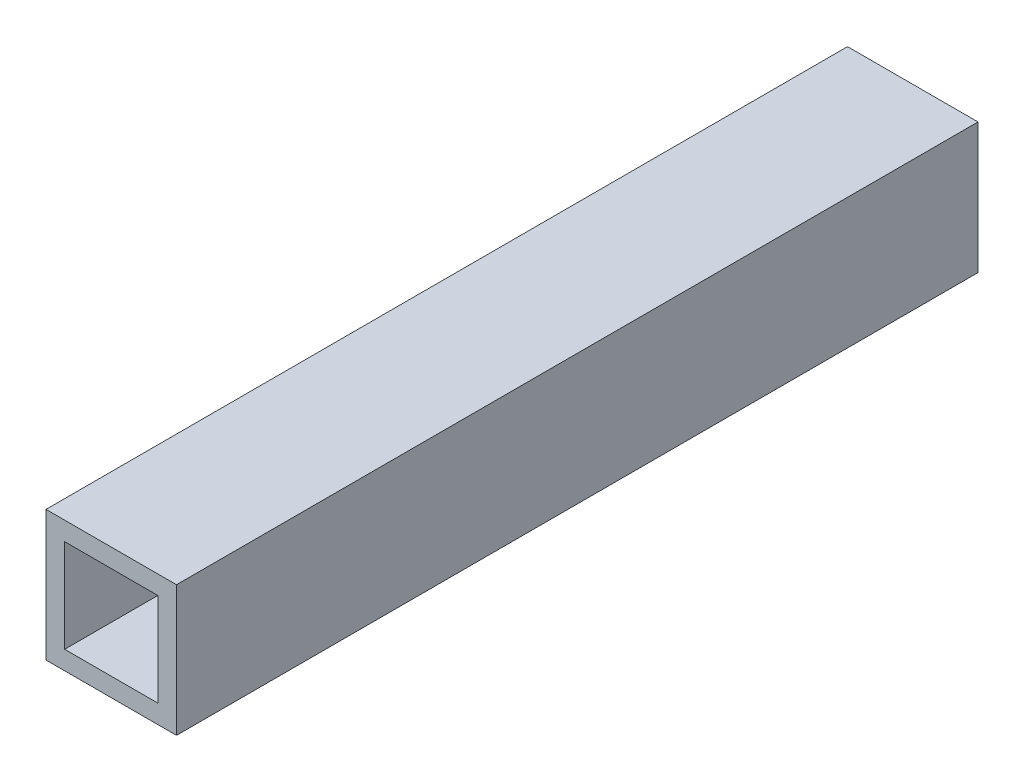
ISO-10303-21;
HEADER;
FILE_DESCRIPTION(('STEP AP214'),'2;1');
FILE_NAME('part.step','',(''),(''),'','','');
FILE_SCHEMA(('AUTOMOTIVE_DESIGN { 1 0 10303 214 1 1 1 1 }'));
ENDSEC;
DATA;
#1=APPLICATION_CONTEXT('core data for automotive mechanical design processes');
#2=APPLICATION_PROTOCOL_DEFINITION('international standard','automotive_design',2000,#1);
#3=PRODUCT_CONTEXT('',#1,'mechanical');
#4=PRODUCT('Part','Part','',(#3));
#5=PRODUCT_RELATED_PRODUCT_CATEGORY('part','',(#4));
#6=PRODUCT_DEFINITION_FORMATION('','',#4);
#7=PRODUCT_DEFINITION_CONTEXT('part definition',#1,'design');
#8=PRODUCT_DEFINITION('design','',#6,#7);
#9=PRODUCT_DEFINITION_SHAPE('','',#8);
#10=(LENGTH_UNIT() NAMED_UNIT(*) SI_UNIT(.MILLI.,.METRE.));
#11=(NAMED_UNIT(*) PLANE_ANGLE_UNIT() SI_UNIT($,.RADIAN.));
#12=(NAMED_UNIT(*) SI_UNIT($,.STERADIAN.) SOLID_ANGLE_UNIT());
#13=UNCERTAINTY_MEASURE_WITH_UNIT(LENGTH_MEASURE(1.E-05),#10,'distance_accuracy_value','');
#14=(GEOMETRIC_REPRESENTATION_CONTEXT(3) GLOBAL_UNCERTAINTY_ASSIGNED_CONTEXT((#13)) GLOBAL_UNIT_ASSIGNED_CONTEXT((#10,
#11,#12)) REPRESENTATION_CONTEXT('',''));
#15=CARTESIAN_POINT('',(0.,0.,0.));
#16=DIRECTION('',(0.,0.,1.));
#17=DIRECTION('',(1.,0.,0.));
#18=AXIS2_PLACEMENT_3D('',#15,#16,#17);
#19=CARTESIAN_POINT('',(-2.,-2.9,0.));
#20=DIRECTION('',(-1.,0.,0.));
#21=DIRECTION('',(0.,0.,1.));
#22=AXIS2_PLACEMENT_3D('',#19,#20,#21);
#23=PLANE('',#22);
#24=DIRECTION('',(0.,0.,-1.));
#25=VECTOR('',#24,1.);
#26=CARTESIAN_POINT('',(-2.,-2.9,0.));
#27=LINE('',#26,#25);
#28=CARTESIAN_POINT('',(-2.,-2.9,4.3));
#29=VERTEX_POINT('',#28);
#30=CARTESIAN_POINT('',(-2.,-2.9,0.));
#31=VERTEX_POINT('',#30);
#32=EDGE_CURVE('E92',#29,#31,#27,.T.);
#33=ORIENTED_EDGE('',*,*,#32,.T.);
#34=DIRECTION('',(0.,1.,0.));
#35=VECTOR('',#34,1.);
#36=CARTESIAN_POINT('',(-2.,-2.9,0.));
#37=LINE('',#36,#35);
#38=CARTESIAN_POINT('',(-2.,-2.4,0.));
#39=VERTEX_POINT('',#38);
#40=EDGE_CURVE('E20',#39,#31,#37,.F.);
#41=ORIENTED_EDGE('',*,*,#40,.F.);
#42=DIRECTION('',(0.,0.,1.));
#43=VECTOR('',#42,1.);
#44=CARTESIAN_POINT('',(-2.,-2.4,0.));
#45=LINE('',#44,#43);
#46=CARTESIAN_POINT('',(-2.,-2.4,4.3));
#47=VERTEX_POINT('',#46);
#48=EDGE_CURVE('E110',#39,#47,#45,.T.);
#49=ORIENTED_EDGE('',*,*,#48,.T.);
#50=DIRECTION('',(0.,1.,0.));
#51=VECTOR('',#50,1.);
#52=CARTESIAN_POINT('',(-2.,-2.9,4.3));
#53=LINE('',#52,#51);
#54=EDGE_CURVE('E79',#29,#47,#53,.T.);
#55=ORIENTED_EDGE('',*,*,#54,.F.);
#56=EDGE_LOOP('',(#33,#41,#49,#55));
#57=FACE_BOUND('',#56,.T.);
#58=ADVANCED_FACE('F17',(#57),#23,.F.);
#59=CARTESIAN_POINT('',(-1.5,-2.9,0.));
#60=DIRECTION('',(0.,-1.,0.));
#61=DIRECTION('',(0.,0.,-1.));
#62=AXIS2_PLACEMENT_3D('',#59,#60,#61);
#63=PLANE('',#62);
#64=DIRECTION('',(0.,0.,-1.));
#65=VECTOR('',#64,1.);
#66=CARTESIAN_POINT('',(-1.5,-2.9,0.));
#67=LINE('',#66,#65);
#68=CARTESIAN_POINT('',(-1.5,-2.9,4.3));
#69=VERTEX_POINT('',#68);
#70=CARTESIAN_POINT('',(-1.5,-2.9,0.));
#71=VERTEX_POINT('',#70);
#72=EDGE_CURVE('E97',#69,#71,#67,.T.);
#73=ORIENTED_EDGE('',*,*,#72,.T.);
#74=DIRECTION('',(1.,0.,0.));
#75=VECTOR('',#74,1.);
#76=CARTESIAN_POINT('',(-1.5,-2.9,0.));
#77=LINE('',#76,#75);
#78=EDGE_CURVE('E87',#31,#71,#77,.T.);
#79=ORIENTED_EDGE('',*,*,#78,.F.);
#80=ORIENTED_EDGE('',*,*,#32,.F.);
#81=DIRECTION('',(1.,0.,0.));
#82=VECTOR('',#81,1.);
#83=CARTESIAN_POINT('',(-1.5,-2.9,4.3));
#84=LINE('',#83,#82);
#85=EDGE_CURVE('E99',#69,#29,#84,.F.);
#86=ORIENTED_EDGE('',*,*,#85,.F.);
#87=EDGE_LOOP('',(#73,#79,#80,#86));
#88=FACE_BOUND('',#87,.T.);
#89=ADVANCED_FACE('F95',(#88),#63,.F.);
#90=CARTESIAN_POINT('',(-2.,-2.4,0.));
#91=DIRECTION('',(0.,1.,0.));
#92=DIRECTION('',(0.,0.,1.));
#93=AXIS2_PLACEMENT_3D('',#90,#91,#92);
#94=PLANE('',#93);
#95=ORIENTED_EDGE('',*,*,#48,.F.);
#96=DIRECTION('',(1.,0.,0.));
#97=VECTOR('',#96,1.);
#98=CARTESIAN_POINT('',(-2.,-2.4,0.));
#99=LINE('',#98,#97);
#100=CARTESIAN_POINT('',(-1.5,-2.4,0.));
#101=VERTEX_POINT('',#100);
#102=EDGE_CURVE('E89',#101,#39,#99,.F.);
#103=ORIENTED_EDGE('',*,*,#102,.F.);
#104=DIRECTION('',(0.,0.,-1.));
#105=VECTOR('',#104,1.);
#106=CARTESIAN_POINT('',(-1.5,-2.4,0.));
#107=LINE('',#106,#105);
#108=CARTESIAN_POINT('',(-1.5,-2.4,4.3));
#109=VERTEX_POINT('',#108);
#110=EDGE_CURVE('E115',#101,#109,#107,.F.);
#111=ORIENTED_EDGE('',*,*,#110,.T.);
#112=DIRECTION('',(1.,0.,0.));
#113=VECTOR('',#112,1.);
#114=CARTESIAN_POINT('',(-1.75,-2.4,4.3));
#115=LINE('',#114,#113);
#116=EDGE_CURVE('E109',#47,#109,#115,.T.);
#117=ORIENTED_EDGE('',*,*,#116,.F.);
#118=EDGE_LOOP('',(#95,#103,#111,#117));
#119=FACE_BOUND('',#118,.T.);
#120=ADVANCED_FACE('F113',(#119),#94,.F.);
#121=CARTESIAN_POINT('',(-1.5,-2.4,0.));
#122=DIRECTION('',(1.,0.,0.));
#123=DIRECTION('',(0.,0.,-1.));
#124=AXIS2_PLACEMENT_3D('',#121,#122,#123);
#125=PLANE('',#124);
#126=ORIENTED_EDGE('',*,*,#110,.F.);
#127=DIRECTION('',(0.,1.,0.));
#128=VECTOR('',#127,1.);
#129=CARTESIAN_POINT('',(-1.5,-2.65,0.));
#130=LINE('',#129,#128);
#131=EDGE_CURVE('E159',#101,#71,#130,.F.);
#132=ORIENTED_EDGE('',*,*,#131,.T.);
#133=ORIENTED_EDGE('',*,*,#72,.F.);
#134=DIRECTION('',(0.,1.,0.));
#135=VECTOR('',#134,1.);
#136=CARTESIAN_POINT('',(-1.5,-2.65,4.3));
#137=LINE('',#136,#135);
#138=EDGE_CURVE('E118',#109,#69,#137,.F.);
#139=ORIENTED_EDGE('',*,*,#138,.F.);
#140=EDGE_LOOP('',(#126,#132,#133,#139));
#141=FACE_BOUND('',#140,.T.);
#142=ADVANCED_FACE('F163',(#141),#125,.F.);
#143=CARTESIAN_POINT('',(-2.1,-2.3,0.));
#144=DIRECTION('',(0.,1.,0.));
#145=DIRECTION('',(0.,0.,1.));
#146=AXIS2_PLACEMENT_3D('',#143,#144,#145);
#147=PLANE('',#146);
#148=DIRECTION('',(1.,0.,0.));
#149=VECTOR('',#148,1.);
#150=CARTESIAN_POINT('',(-1.75,-2.3,0.));
#151=LINE('',#150,#149);
#152=CARTESIAN_POINT('',(-1.4,-2.3,0.));
#153=VERTEX_POINT('',#152);
#154=CARTESIAN_POINT('',(-2.1,-2.3,0.));
#155=VERTEX_POINT('',#154);
#156=EDGE_CURVE('E139',#153,#155,#151,.F.);
#157=ORIENTED_EDGE('',*,*,#156,.T.);
#158=DIRECTION('',(0.,0.,1.));
#159=VECTOR('',#158,1.);
#160=CARTESIAN_POINT('',(-2.1,-2.3,0.));
#161=LINE('',#160,#159);
#162=CARTESIAN_POINT('',(-2.1,-2.3,4.3));
#163=VERTEX_POINT('',#162);
#164=EDGE_CURVE('E121',#163,#155,#161,.F.);
#165=ORIENTED_EDGE('',*,*,#164,.F.);
#166=DIRECTION('',(1.,0.,0.));
#167=VECTOR('',#166,1.);
#168=CARTESIAN_POINT('',(-1.75,-2.3,4.3));
#169=LINE('',#168,#167);
#170=CARTESIAN_POINT('',(-1.4,-2.3,4.3));
#171=VERTEX_POINT('',#170);
#172=EDGE_CURVE('E123',#171,#163,#169,.F.);
#173=ORIENTED_EDGE('',*,*,#172,.F.);
#174=DIRECTION('',(0.,0.,-1.));
#175=VECTOR('',#174,1.);
#176=CARTESIAN_POINT('',(-1.4,-2.3,0.));
#177=LINE('',#176,#175);
#178=EDGE_CURVE('E152',#153,#171,#177,.F.);
#179=ORIENTED_EDGE('',*,*,#178,.F.);
#180=EDGE_LOOP('',(#157,#165,#173,#179));
#181=FACE_BOUND('',#180,.T.);
#182=ADVANCED_FACE('F138',(#181),#147,.T.);
#183=CARTESIAN_POINT('',(-1.75,-2.65,4.3));
#184=DIRECTION('',(0.,0.,1.));
#185=DIRECTION('',(1.,0.,0.));
#186=AXIS2_PLACEMENT_3D('',#183,#184,#185);
#187=PLANE('',#186);
#188=ORIENTED_EDGE('',*,*,#54,.T.);
#189=ORIENTED_EDGE('',*,*,#116,.T.);
#190=ORIENTED_EDGE('',*,*,#138,.T.);
#191=ORIENTED_EDGE('',*,*,#85,.T.);
#192=EDGE_LOOP('',(#188,#189,#190,#191));
#193=FACE_BOUND('',#192,.T.);
#194=DIRECTION('',(0.,1.,0.));
#195=VECTOR('',#194,1.);
#196=CARTESIAN_POINT('',(-2.1,-3.,4.3));
#197=LINE('',#196,#195);
#198=CARTESIAN_POINT('',(-2.1,-3.,4.3));
#199=VERTEX_POINT('',#198);
#200=EDGE_CURVE('E117',#199,#163,#197,.T.);
#201=ORIENTED_EDGE('',*,*,#200,.F.);
#202=DIRECTION('',(1.,0.,0.));
#203=VECTOR('',#202,1.);
#204=CARTESIAN_POINT('',(-1.4,-3.,4.3));
#205=LINE('',#204,#203);
#206=CARTESIAN_POINT('',(-1.4,-3.,4.3));
#207=VERTEX_POINT('',#206);
#208=EDGE_CURVE('E149',#207,#199,#205,.F.);
#209=ORIENTED_EDGE('',*,*,#208,.F.);
#210=DIRECTION('',(0.,1.,0.));
#211=VECTOR('',#210,1.);
#212=CARTESIAN_POINT('',(-1.4,-2.3,4.3));
#213=LINE('',#212,#211);
#214=EDGE_CURVE('E133',#171,#207,#213,.F.);
#215=ORIENTED_EDGE('',*,*,#214,.F.);
#216=ORIENTED_EDGE('',*,*,#172,.T.);
#217=EDGE_LOOP('',(#201,#209,#215,#216));
#218=FACE_BOUND('',#217,.T.);
#219=ADVANCED_FACE('F105',(#193,#218),#187,.T.);
#220=CARTESIAN_POINT('',(-2.1,-3.,0.));
#221=DIRECTION('',(-1.,0.,0.));
#222=DIRECTION('',(0.,0.,1.));
#223=AXIS2_PLACEMENT_3D('',#220,#221,#222);
#224=PLANE('',#223);
#225=DIRECTION('',(0.,1.,0.));
#226=VECTOR('',#225,1.);
#227=CARTESIAN_POINT('',(-2.1,-2.65,0.));
#228=LINE('',#227,#226);
#229=CARTESIAN_POINT('',(-2.1,-3.,0.));
#230=VERTEX_POINT('',#229);
#231=EDGE_CURVE('E142',#155,#230,#228,.F.);
#232=ORIENTED_EDGE('',*,*,#231,.T.);
#233=DIRECTION('',(0.,0.,-1.));
#234=VECTOR('',#233,1.);
#235=CARTESIAN_POINT('',(-2.1,-3.,0.));
#236=LINE('',#235,#234);
#237=EDGE_CURVE('E145',#199,#230,#236,.T.);
#238=ORIENTED_EDGE('',*,*,#237,.F.);
#239=ORIENTED_EDGE('',*,*,#200,.T.);
#240=ORIENTED_EDGE('',*,*,#164,.T.);
#241=EDGE_LOOP('',(#232,#238,#239,#240));
#242=FACE_BOUND('',#241,.T.);
#243=ADVANCED_FACE('F143',(#242),#224,.T.);
#244=CARTESIAN_POINT('',(-1.75,-2.65,0.));
#245=DIRECTION('',(0.,0.,1.));
#246=DIRECTION('',(1.,0.,0.));
#247=AXIS2_PLACEMENT_3D('',#244,#245,#246);
#248=PLANE('',#247);
#249=ORIENTED_EDGE('',*,*,#102,.T.);
#250=ORIENTED_EDGE('',*,*,#40,.T.);
#251=ORIENTED_EDGE('',*,*,#78,.T.);
#252=ORIENTED_EDGE('',*,*,#131,.F.);
#253=EDGE_LOOP('',(#249,#250,#251,#252));
#254=FACE_BOUND('',#253,.T.);
#255=DIRECTION('',(0.,1.,0.));
#256=VECTOR('',#255,1.);
#257=CARTESIAN_POINT('',(-1.4,-2.3,0.));
#258=LINE('',#257,#256);
#259=CARTESIAN_POINT('',(-1.4,-3.,0.));
#260=VERTEX_POINT('',#259);
#261=EDGE_CURVE('E35',#260,#153,#258,.T.);
#262=ORIENTED_EDGE('',*,*,#261,.F.);
#263=DIRECTION('',(1.,0.,0.));
#264=VECTOR('',#263,1.);
#265=CARTESIAN_POINT('',(-1.4,-3.,0.));
#266=LINE('',#265,#264);
#267=EDGE_CURVE('E26',#230,#260,#266,.T.);
#268=ORIENTED_EDGE('',*,*,#267,.F.);
#269=ORIENTED_EDGE('',*,*,#231,.F.);
#270=ORIENTED_EDGE('',*,*,#156,.F.);
#271=EDGE_LOOP('',(#262,#268,#269,#270));
#272=FACE_BOUND('',#271,.T.);
#273=ADVANCED_FACE('F84',(#254,#272),#248,.F.);
#274=CARTESIAN_POINT('',(-1.4,-2.3,0.));
#275=DIRECTION('',(1.,0.,0.));
#276=DIRECTION('',(0.,0.,-1.));
#277=AXIS2_PLACEMENT_3D('',#274,#275,#276);
#278=PLANE('',#277);
#279=ORIENTED_EDGE('',*,*,#261,.T.);
#280=ORIENTED_EDGE('',*,*,#178,.T.);
#281=ORIENTED_EDGE('',*,*,#214,.T.);
#282=DIRECTION('',(0.,0.,-1.));
#283=VECTOR('',#282,1.);
#284=CARTESIAN_POINT('',(-1.4,-3.,0.));
#285=LINE('',#284,#283);
#286=EDGE_CURVE('E11',#260,#207,#285,.F.);
#287=ORIENTED_EDGE('',*,*,#286,.F.);
#288=EDGE_LOOP('',(#279,#280,#281,#287));
#289=FACE_BOUND('',#288,.T.);
#290=ADVANCED_FACE('F174',(#289),#278,.T.);
#291=CARTESIAN_POINT('',(-1.4,-3.,0.));
#292=DIRECTION('',(0.,-1.,0.));
#293=DIRECTION('',(0.,0.,-1.));
#294=AXIS2_PLACEMENT_3D('',#291,#292,#293);
#295=PLANE('',#294);
#296=ORIENTED_EDGE('',*,*,#267,.T.);
#297=ORIENTED_EDGE('',*,*,#286,.T.);
#298=ORIENTED_EDGE('',*,*,#208,.T.);
#299=ORIENTED_EDGE('',*,*,#237,.T.);
#300=EDGE_LOOP('',(#296,#297,#298,#299));
#301=FACE_BOUND('',#300,.T.);
#302=ADVANCED_FACE('F151',(#301),#295,.T.);
#303=CLOSED_SHELL('',(#58,#89,#120,#142,#182,#219,#243,#273,#290,#302));
#304=MANIFOLD_SOLID_BREP('B1',#303);
#305=ADVANCED_BREP_SHAPE_REPRESENTATION('',(#18,#304),#14);
#306=SHAPE_DEFINITION_REPRESENTATION(#9,#305);
ENDSEC;
END-ISO-10303-21;
